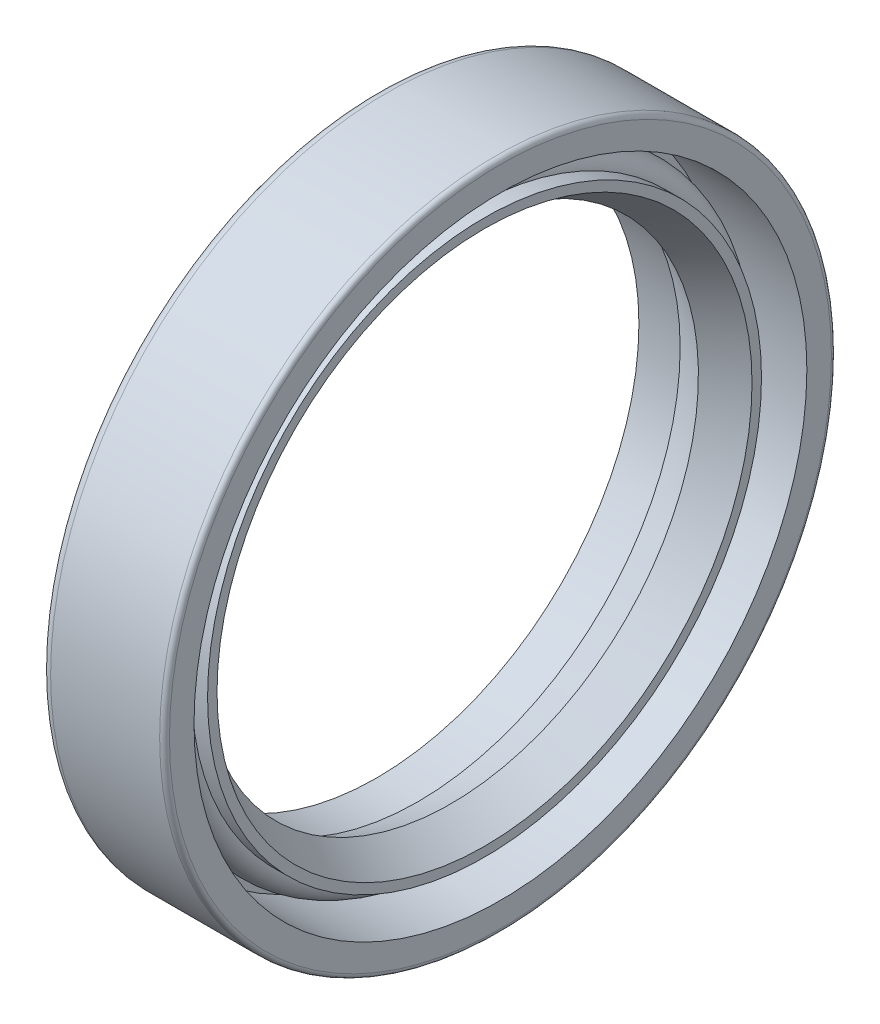
ISO-10303-21;
HEADER;
FILE_DESCRIPTION(('STEP AP214'),'2;1');
FILE_NAME('part.step','',(''),(''),'','','');
FILE_SCHEMA(('AUTOMOTIVE_DESIGN { 1 0 10303 214 1 1 1 1 }'));
ENDSEC;
DATA;
#1=APPLICATION_CONTEXT('core data for automotive mechanical design processes');
#2=APPLICATION_PROTOCOL_DEFINITION('international standard','automotive_design',2000,#1);
#3=PRODUCT_CONTEXT('',#1,'mechanical');
#4=PRODUCT('Part','Part','',(#3));
#5=PRODUCT_RELATED_PRODUCT_CATEGORY('part','',(#4));
#6=PRODUCT_DEFINITION_FORMATION('','',#4);
#7=PRODUCT_DEFINITION_CONTEXT('part definition',#1,'design');
#8=PRODUCT_DEFINITION('design','',#6,#7);
#9=PRODUCT_DEFINITION_SHAPE('','',#8);
#10=(LENGTH_UNIT() NAMED_UNIT(*) SI_UNIT(.MILLI.,.METRE.));
#11=(NAMED_UNIT(*) PLANE_ANGLE_UNIT() SI_UNIT($,.RADIAN.));
#12=(NAMED_UNIT(*) SI_UNIT($,.STERADIAN.) SOLID_ANGLE_UNIT());
#13=UNCERTAINTY_MEASURE_WITH_UNIT(LENGTH_MEASURE(1.E-05),#10,'distance_accuracy_value','');
#14=(GEOMETRIC_REPRESENTATION_CONTEXT(3) GLOBAL_UNCERTAINTY_ASSIGNED_CONTEXT((#13)) GLOBAL_UNIT_ASSIGNED_CONTEXT((#10,
#11,#12)) REPRESENTATION_CONTEXT('',''));
#15=CARTESIAN_POINT('',(0.,0.,0.));
#16=DIRECTION('',(0.,0.,1.));
#17=DIRECTION('',(1.,0.,0.));
#18=AXIS2_PLACEMENT_3D('',#15,#16,#17);
#19=CARTESIAN_POINT('',(6.72222222222222,0.,0.));
#20=DIRECTION('',(-1.,0.,0.));
#21=DIRECTION('',(0.,0.,1.));
#22=AXIS2_PLACEMENT_3D('',#19,#20,#21);
#23=CYLINDRICAL_SURFACE('',#22,15.6666666666667);
#24=CARTESIAN_POINT('',(2.333333,0.,0.));
#25=DIRECTION('',(-1.,0.,0.));
#26=DIRECTION('',(0.,0.,1.));
#27=AXIS2_PLACEMENT_3D('',#24,#25,#26);
#28=CIRCLE('',#27,15.6666666666667);
#29=CARTESIAN_POINT('',(2.333333,0.,15.6666666666667));
#30=VERTEX_POINT('',#29);
#31=EDGE_CURVE('E116',#30,#30,#28,.T.);
#32=ORIENTED_EDGE('',*,*,#31,.F.);
#33=EDGE_LOOP('',(#32));
#34=FACE_BOUND('',#33,.T.);
#35=CARTESIAN_POINT('',(3.1999998,0.,0.));
#36=DIRECTION('',(1.,0.,0.));
#37=DIRECTION('',(0.,0.,-1.));
#38=AXIS2_PLACEMENT_3D('',#35,#36,#37);
#39=CIRCLE('',#38,15.6666666666667);
#40=CARTESIAN_POINT('',(3.1999998,0.,-15.6666666666667));
#41=VERTEX_POINT('',#40);
#42=EDGE_CURVE('E113',#41,#41,#39,.T.);
#43=ORIENTED_EDGE('',*,*,#42,.F.);
#44=EDGE_LOOP('',(#43));
#45=FACE_BOUND('',#44,.T.);
#46=ADVANCED_FACE('F16',(#34,#45),#23,.T.);
#47=CARTESIAN_POINT('',(2.333333,15.6666666666667,0.));
#48=DIRECTION('',(1.,0.,0.));
#49=DIRECTION('',(0.,0.,-1.));
#50=AXIS2_PLACEMENT_3D('',#47,#48,#49);
#51=PLANE('',#50);
#52=ORIENTED_EDGE('',*,*,#31,.T.);
#53=EDGE_LOOP('',(#52));
#54=FACE_BOUND('',#53,.T.);
#55=CARTESIAN_POINT('',(2.333333,0.,0.));
#56=DIRECTION('',(-1.,0.,0.));
#57=DIRECTION('',(0.,0.,1.));
#58=AXIS2_PLACEMENT_3D('',#55,#56,#57);
#59=CIRCLE('',#58,17.3333333333333);
#60=CARTESIAN_POINT('',(2.333333,0.,17.3333333333333));
#61=VERTEX_POINT('',#60);
#62=EDGE_CURVE('E128',#61,#61,#59,.F.);
#63=ORIENTED_EDGE('',*,*,#62,.T.);
#64=EDGE_LOOP('',(#63));
#65=FACE_BOUND('',#64,.T.);
#66=ADVANCED_FACE('F109',(#54,#65),#51,.T.);
#67=CARTESIAN_POINT('',(4.1999998,0.,0.));
#68=DIRECTION('',(1.,0.,0.));
#69=DIRECTION('',(0.,0.,-1.));
#70=AXIS2_PLACEMENT_3D('',#67,#68,#69);
#71=TOROIDAL_SURFACE('',#70,15.6666666666667,1.);
#72=ORIENTED_EDGE('',*,*,#42,.T.);
#73=EDGE_LOOP('',(#72));
#74=FACE_BOUND('',#73,.T.);
#75=CARTESIAN_POINT('',(5.1999998,0.,0.));
#76=DIRECTION('',(-1.,0.,0.));
#77=DIRECTION('',(0.,0.,1.));
#78=AXIS2_PLACEMENT_3D('',#75,#76,#77);
#79=CIRCLE('',#78,15.6666666666667);
#80=CARTESIAN_POINT('',(5.1999998,0.,15.6666666666667));
#81=VERTEX_POINT('',#80);
#82=EDGE_CURVE('E66',#81,#81,#79,.F.);
#83=ORIENTED_EDGE('',*,*,#82,.F.);
#84=EDGE_LOOP('',(#83));
#85=FACE_BOUND('',#84,.T.);
#86=ADVANCED_FACE('F106',(#74,#85),#71,.T.);
#87=CARTESIAN_POINT('',(6.72222222222222,0.,0.));
#88=DIRECTION('',(-1.,0.,0.));
#89=DIRECTION('',(0.,0.,1.));
#90=AXIS2_PLACEMENT_3D('',#87,#88,#89);
#91=CYLINDRICAL_SURFACE('',#90,17.3333333333333);
#92=CARTESIAN_POINT('',(7.,0.,0.));
#93=DIRECTION('',(-1.,0.,0.));
#94=DIRECTION('',(0.,0.,1.));
#95=AXIS2_PLACEMENT_3D('',#92,#93,#94);
#96=CIRCLE('',#95,17.3333333333333);
#97=CARTESIAN_POINT('',(7.,0.,17.3333333333333));
#98=VERTEX_POINT('',#97);
#99=EDGE_CURVE('E124',#98,#98,#96,.T.);
#100=ORIENTED_EDGE('',*,*,#99,.F.);
#101=EDGE_LOOP('',(#100));
#102=FACE_BOUND('',#101,.T.);
#103=ORIENTED_EDGE('',*,*,#62,.F.);
#104=EDGE_LOOP('',(#103));
#105=FACE_BOUND('',#104,.T.);
#106=ADVANCED_FACE('F102',(#102,#105),#91,.F.);
#107=CARTESIAN_POINT('',(6.72222222222222,0.,0.));
#108=DIRECTION('',(-1.,0.,0.));
#109=DIRECTION('',(0.,0.,1.));
#110=AXIS2_PLACEMENT_3D('',#107,#108,#109);
#111=CYLINDRICAL_SURFACE('',#110,15.6666666666667);
#112=ORIENTED_EDGE('',*,*,#82,.T.);
#113=EDGE_LOOP('',(#112));
#114=FACE_BOUND('',#113,.T.);
#115=CARTESIAN_POINT('',(6.0999999,0.,0.));
#116=DIRECTION('',(-1.,0.,0.));
#117=DIRECTION('',(0.,0.,1.));
#118=AXIS2_PLACEMENT_3D('',#115,#116,#117);
#119=CIRCLE('',#118,15.6666666666667);
#120=CARTESIAN_POINT('',(6.0999999,0.,15.6666666666667));
#121=VERTEX_POINT('',#120);
#122=EDGE_CURVE('E52',#121,#121,#119,.F.);
#123=ORIENTED_EDGE('',*,*,#122,.F.);
#124=EDGE_LOOP('',(#123));
#125=FACE_BOUND('',#124,.T.);
#126=ADVANCED_FACE('F97',(#114,#125),#111,.T.);
#127=CARTESIAN_POINT('',(7.,17.3333333333333,0.));
#128=DIRECTION('',(1.,0.,0.));
#129=DIRECTION('',(0.,0.,-1.));
#130=AXIS2_PLACEMENT_3D('',#127,#128,#129);
#131=PLANE('',#130);
#132=ORIENTED_EDGE('',*,*,#99,.T.);
#133=EDGE_LOOP('',(#132));
#134=FACE_BOUND('',#133,.T.);
#135=CARTESIAN_POINT('',(7.,0.,0.));
#136=DIRECTION('',(-1.,0.,0.));
#137=DIRECTION('',(0.,0.,-1.));
#138=AXIS2_PLACEMENT_3D('',#135,#136,#137);
#139=CIRCLE('',#138,18.7222222222222);
#140=CARTESIAN_POINT('',(7.,0.,-18.7222222222222));
#141=VERTEX_POINT('',#140);
#142=CARTESIAN_POINT('',(7.,0.,18.7222222222222));
#143=VERTEX_POINT('',#142);
#144=EDGE_CURVE('E44',#141,#143,#139,.T.);
#145=ORIENTED_EDGE('',*,*,#144,.F.);
#146=CARTESIAN_POINT('',(7.,0.,0.));
#147=DIRECTION('',(-1.,0.,0.));
#148=DIRECTION('',(0.,0.,1.));
#149=AXIS2_PLACEMENT_3D('',#146,#147,#148);
#150=CIRCLE('',#149,18.7222222222222);
#151=EDGE_CURVE('E47',#143,#141,#150,.T.);
#152=ORIENTED_EDGE('',*,*,#151,.F.);
#153=EDGE_LOOP('',(#145,#152));
#154=FACE_BOUND('',#153,.T.);
#155=ADVANCED_FACE('F49',(#134,#154),#131,.T.);
#156=CARTESIAN_POINT('',(6.0999999,15.1309523596939,0.));
#157=DIRECTION('',(1.,0.,0.));
#158=DIRECTION('',(0.,0.,-1.));
#159=AXIS2_PLACEMENT_3D('',#156,#157,#158);
#160=PLANE('',#159);
#161=CARTESIAN_POINT('',(6.09999990001597,0.,0.));
#162=DIRECTION('',(1.,0.,0.));
#163=DIRECTION('',(0.,1.,0.));
#164=AXIS2_PLACEMENT_3D('',#161,#162,#163);
#165=CIRCLE('',#164,15.130952359664);
#166=CARTESIAN_POINT('',(6.09999990001597,15.130952359664,0.));
#167=VERTEX_POINT('',#166);
#168=EDGE_CURVE('E58',#167,#167,#165,.F.);
#169=ORIENTED_EDGE('',*,*,#168,.T.);
#170=EDGE_LOOP('',(#169));
#171=FACE_BOUND('',#170,.T.);
#172=ORIENTED_EDGE('',*,*,#122,.T.);
#173=EDGE_LOOP('',(#172));
#174=FACE_BOUND('',#173,.T.);
#175=ADVANCED_FACE('F79',(#171,#174),#160,.T.);
#176=CARTESIAN_POINT('',(6.72222222222222,0.,0.));
#177=DIRECTION('',(1.,0.,0.));
#178=DIRECTION('',(0.,0.,-1.));
#179=AXIS2_PLACEMENT_3D('',#176,#177,#178);
#180=TOROIDAL_SURFACE('',#179,18.7222222222222,0.27777777777778);
#181=CARTESIAN_POINT('',(6.72222222222222,0.,0.));
#182=DIRECTION('',(-1.,0.,0.));
#183=DIRECTION('',(0.,0.,1.));
#184=AXIS2_PLACEMENT_3D('',#181,#182,#183);
#185=CIRCLE('',#184,19.);
#186=CARTESIAN_POINT('',(6.72222222222222,0.,19.));
#187=VERTEX_POINT('',#186);
#188=EDGE_CURVE('E85',#187,#187,#185,.T.);
#189=ORIENTED_EDGE('',*,*,#188,.F.);
#190=EDGE_LOOP('',(#189));
#191=FACE_BOUND('',#190,.T.);
#192=ORIENTED_EDGE('',*,*,#144,.T.);
#193=ORIENTED_EDGE('',*,*,#151,.T.);
#194=EDGE_LOOP('',(#192,#193));
#195=FACE_BOUND('',#194,.T.);
#196=ADVANCED_FACE('F56',(#191,#195),#180,.T.);
#197=CARTESIAN_POINT('',(6.09999990007282,0.,0.));
#198=DIRECTION('',(1.,0.,0.));
#199=DIRECTION('',(0.,1.,0.));
#200=AXIS2_PLACEMENT_3D('',#197,#198,#199);
#201=CONICAL_SURFACE('',#200,15.1309523596979,0.536910711338676);
#202=ORIENTED_EDGE('',*,*,#168,.F.);
#203=EDGE_LOOP('',(#202));
#204=FACE_BOUND('',#203,.T.);
#205=CARTESIAN_POINT('',(4.19999979999375,0.,0.));
#206=DIRECTION('',(-1.,0.,0.));
#207=DIRECTION('',(0.,0.,1.));
#208=AXIS2_PLACEMENT_3D('',#205,#206,#207);
#209=CIRCLE('',#208,13.9999999999816);
#210=CARTESIAN_POINT('',(4.19999979999375,0.,13.9999999999816));
#211=VERTEX_POINT('',#210);
#212=EDGE_CURVE('E177',#211,#211,#209,.T.);
#213=ORIENTED_EDGE('',*,*,#212,.T.);
#214=EDGE_LOOP('',(#213));
#215=FACE_BOUND('',#214,.T.);
#216=ADVANCED_FACE('F78',(#204,#215),#201,.F.);
#217=CARTESIAN_POINT('',(6.72222222222222,0.,0.));
#218=DIRECTION('',(-1.,0.,0.));
#219=DIRECTION('',(0.,0.,1.));
#220=AXIS2_PLACEMENT_3D('',#217,#218,#219);
#221=CYLINDRICAL_SURFACE('',#220,19.);
#222=ORIENTED_EDGE('',*,*,#188,.T.);
#223=EDGE_LOOP('',(#222));
#224=FACE_BOUND('',#223,.T.);
#225=CARTESIAN_POINT('',(0.555555555555555,0.,0.));
#226=DIRECTION('',(1.,0.,0.));
#227=DIRECTION('',(0.,0.,-1.));
#228=AXIS2_PLACEMENT_3D('',#225,#226,#227);
#229=CIRCLE('',#228,19.);
#230=CARTESIAN_POINT('',(0.555555555555555,0.,-19.));
#231=VERTEX_POINT('',#230);
#232=EDGE_CURVE('E174',#231,#231,#229,.F.);
#233=ORIENTED_EDGE('',*,*,#232,.F.);
#234=EDGE_LOOP('',(#233));
#235=FACE_BOUND('',#234,.T.);
#236=ADVANCED_FACE('F188',(#224,#235),#221,.T.);
#237=CARTESIAN_POINT('',(2.33333300002414,0.,0.));
#238=DIRECTION('',(-1.,0.,0.));
#239=DIRECTION('',(0.,0.,1.));
#240=AXIS2_PLACEMENT_3D('',#237,#238,#239);
#241=CONICAL_SURFACE('',#240,14.8333333332857,0.419879930609907);
#242=CARTESIAN_POINT('',(2.333333,0.,0.));
#243=DIRECTION('',(-1.,0.,0.));
#244=DIRECTION('',(0.,0.,1.));
#245=AXIS2_PLACEMENT_3D('',#242,#243,#244);
#246=CIRCLE('',#245,14.8333333333333);
#247=CARTESIAN_POINT('',(2.333333,0.,14.8333333333333));
#248=VERTEX_POINT('',#247);
#249=EDGE_CURVE('E165',#248,#248,#246,.T.);
#250=ORIENTED_EDGE('',*,*,#249,.T.);
#251=EDGE_LOOP('',(#250));
#252=FACE_BOUND('',#251,.T.);
#253=ORIENTED_EDGE('',*,*,#212,.F.);
#254=EDGE_LOOP('',(#253));
#255=FACE_BOUND('',#254,.T.);
#256=ADVANCED_FACE('F152',(#252,#255),#241,.F.);
#257=CARTESIAN_POINT('',(0.555555555555555,0.,0.));
#258=DIRECTION('',(1.,0.,0.));
#259=DIRECTION('',(0.,0.,-1.));
#260=AXIS2_PLACEMENT_3D('',#257,#258,#259);
#261=TOROIDAL_SURFACE('',#260,18.4444444444444,0.555555555555556);
#262=ORIENTED_EDGE('',*,*,#232,.T.);
#263=EDGE_LOOP('',(#262));
#264=FACE_BOUND('',#263,.T.);
#265=CARTESIAN_POINT('',(0.,0.,0.));
#266=DIRECTION('',(1.,0.,0.));
#267=DIRECTION('',(0.,0.,1.));
#268=AXIS2_PLACEMENT_3D('',#265,#266,#267);
#269=CIRCLE('',#268,18.4444444444444);
#270=CARTESIAN_POINT('',(0.,0.,-18.4444444444444));
#271=VERTEX_POINT('',#270);
#272=CARTESIAN_POINT('',(0.,0.,18.4444444444444));
#273=VERTEX_POINT('',#272);
#274=EDGE_CURVE('E28',#271,#273,#269,.F.);
#275=ORIENTED_EDGE('',*,*,#274,.F.);
#276=CARTESIAN_POINT('',(0.,0.,0.));
#277=DIRECTION('',(1.,0.,0.));
#278=DIRECTION('',(0.,0.,-1.));
#279=AXIS2_PLACEMENT_3D('',#276,#277,#278);
#280=CIRCLE('',#279,18.4444444444444);
#281=EDGE_CURVE('E136',#273,#271,#280,.F.);
#282=ORIENTED_EDGE('',*,*,#281,.F.);
#283=EDGE_LOOP('',(#275,#282));
#284=FACE_BOUND('',#283,.T.);
#285=ADVANCED_FACE('F140',(#264,#284),#261,.T.);
#286=CARTESIAN_POINT('',(6.72222222222222,0.,0.));
#287=DIRECTION('',(-1.,0.,0.));
#288=DIRECTION('',(0.,0.,1.));
#289=AXIS2_PLACEMENT_3D('',#286,#287,#288);
#290=CYLINDRICAL_SURFACE('',#289,14.8333333333333);
#291=CARTESIAN_POINT('',(0.,0.,0.));
#292=DIRECTION('',(-1.,0.,0.));
#293=DIRECTION('',(0.,0.,1.));
#294=AXIS2_PLACEMENT_3D('',#291,#292,#293);
#295=CIRCLE('',#294,14.8333333333333);
#296=CARTESIAN_POINT('',(0.,0.,14.8333333333333));
#297=VERTEX_POINT('',#296);
#298=EDGE_CURVE('E11',#297,#297,#295,.F.);
#299=ORIENTED_EDGE('',*,*,#298,.F.);
#300=EDGE_LOOP('',(#299));
#301=FACE_BOUND('',#300,.T.);
#302=ORIENTED_EDGE('',*,*,#249,.F.);
#303=EDGE_LOOP('',(#302));
#304=FACE_BOUND('',#303,.T.);
#305=ADVANCED_FACE('F151',(#301,#304),#290,.F.);
#306=CARTESIAN_POINT('',(0.,18.4444444444444,0.));
#307=DIRECTION('',(-1.,0.,0.));
#308=DIRECTION('',(0.,0.,1.));
#309=AXIS2_PLACEMENT_3D('',#306,#307,#308);
#310=PLANE('',#309);
#311=ORIENTED_EDGE('',*,*,#298,.T.);
#312=EDGE_LOOP('',(#311));
#313=FACE_BOUND('',#312,.T.);
#314=ORIENTED_EDGE('',*,*,#281,.T.);
#315=ORIENTED_EDGE('',*,*,#274,.T.);
#316=EDGE_LOOP('',(#314,#315));
#317=FACE_BOUND('',#316,.T.);
#318=ADVANCED_FACE('F198',(#313,#317),#310,.T.);
#319=CLOSED_SHELL('',(#46,#66,#86,#106,#126,#155,#175,#196,#216,#236,#256,#285,#305,#318));
#320=MANIFOLD_SOLID_BREP('B1',#319);
#321=ADVANCED_BREP_SHAPE_REPRESENTATION('',(#18,#320),#14);
#322=SHAPE_DEFINITION_REPRESENTATION(#9,#321);
ENDSEC;
END-ISO-10303-21;
